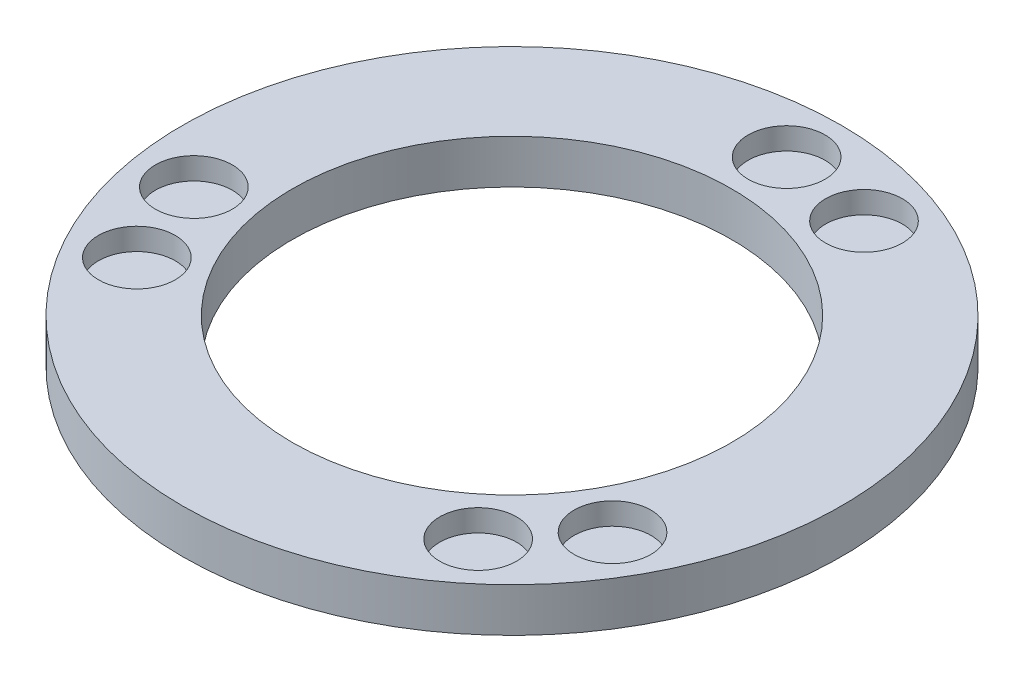
ISO-10303-21;
HEADER;
FILE_DESCRIPTION(('STEP AP214'),'2;1');
FILE_NAME('part.step','',(''),(''),'','','');
FILE_SCHEMA(('AUTOMOTIVE_DESIGN { 1 0 10303 214 1 1 1 1 }'));
ENDSEC;
DATA;
#1=APPLICATION_CONTEXT('core data for automotive mechanical design processes');
#2=APPLICATION_PROTOCOL_DEFINITION('international standard','automotive_design',2000,#1);
#3=PRODUCT_CONTEXT('',#1,'mechanical');
#4=PRODUCT('Part','Part','',(#3));
#5=PRODUCT_RELATED_PRODUCT_CATEGORY('part','',(#4));
#6=PRODUCT_DEFINITION_FORMATION('','',#4);
#7=PRODUCT_DEFINITION_CONTEXT('part definition',#1,'design');
#8=PRODUCT_DEFINITION('design','',#6,#7);
#9=PRODUCT_DEFINITION_SHAPE('','',#8);
#10=(LENGTH_UNIT() NAMED_UNIT(*) SI_UNIT(.MILLI.,.METRE.));
#11=(NAMED_UNIT(*) PLANE_ANGLE_UNIT() SI_UNIT($,.RADIAN.));
#12=(NAMED_UNIT(*) SI_UNIT($,.STERADIAN.) SOLID_ANGLE_UNIT());
#13=UNCERTAINTY_MEASURE_WITH_UNIT(LENGTH_MEASURE(1.E-05),#10,'distance_accuracy_value','');
#14=(GEOMETRIC_REPRESENTATION_CONTEXT(3) GLOBAL_UNCERTAINTY_ASSIGNED_CONTEXT((#13)) GLOBAL_UNIT_ASSIGNED_CONTEXT((#10,
#11,#12)) REPRESENTATION_CONTEXT('',''));
#15=CARTESIAN_POINT('',(0.,0.,0.));
#16=DIRECTION('',(0.,0.,1.));
#17=DIRECTION('',(1.,0.,0.));
#18=AXIS2_PLACEMENT_3D('',#15,#16,#17);
#19=CARTESIAN_POINT('',(0.,-20.,0.));
#20=DIRECTION('',(0.,1.,0.));
#21=DIRECTION('',(0.,0.,1.));
#22=AXIS2_PLACEMENT_3D('',#19,#20,#21);
#23=CYLINDRICAL_SURFACE('',#22,150.);
#24=CARTESIAN_POINT('',(0.,-20.,0.));
#25=DIRECTION('',(0.,1.,0.));
#26=DIRECTION('',(0.,0.,1.));
#27=AXIS2_PLACEMENT_3D('',#24,#25,#26);
#28=CIRCLE('',#27,150.);
#29=CARTESIAN_POINT('',(0.,-20.,150.));
#30=VERTEX_POINT('',#29);
#31=EDGE_CURVE('E10',#30,#30,#28,.T.);
#32=ORIENTED_EDGE('',*,*,#31,.T.);
#33=EDGE_LOOP('',(#32));
#34=FACE_BOUND('',#33,.T.);
#35=CARTESIAN_POINT('',(0.,0.,0.));
#36=DIRECTION('',(0.,1.,0.));
#37=DIRECTION('',(0.,0.,1.));
#38=AXIS2_PLACEMENT_3D('',#35,#36,#37);
#39=CIRCLE('',#38,150.);
#40=CARTESIAN_POINT('',(0.,0.,150.));
#41=VERTEX_POINT('',#40);
#42=EDGE_CURVE('E44',#41,#41,#39,.T.);
#43=ORIENTED_EDGE('',*,*,#42,.F.);
#44=EDGE_LOOP('',(#43));
#45=FACE_BOUND('',#44,.T.);
#46=ADVANCED_FACE('F41',(#34,#45),#23,.T.);
#47=CARTESIAN_POINT('',(0.,-20.,0.));
#48=DIRECTION('',(0.,1.,0.));
#49=DIRECTION('',(0.,0.,1.));
#50=AXIS2_PLACEMENT_3D('',#47,#48,#49);
#51=PLANE('',#50);
#52=CARTESIAN_POINT('',(0.,-20.,0.));
#53=DIRECTION('',(0.,1.,0.));
#54=DIRECTION('',(0.,0.,1.));
#55=AXIS2_PLACEMENT_3D('',#52,#53,#54);
#56=CIRCLE('',#55,100.);
#57=CARTESIAN_POINT('',(0.,-20.,100.));
#58=VERTEX_POINT('',#57);
#59=EDGE_CURVE('E56',#58,#58,#56,.T.);
#60=ORIENTED_EDGE('',*,*,#59,.T.);
#61=EDGE_LOOP('',(#60));
#62=FACE_BOUND('',#61,.T.);
#63=ORIENTED_EDGE('',*,*,#31,.F.);
#64=EDGE_LOOP('',(#63));
#65=FACE_BOUND('',#64,.T.);
#66=ADVANCED_FACE('F122',(#62,#65),#51,.F.);
#67=CARTESIAN_POINT('',(0.,0.,0.));
#68=DIRECTION('',(0.,1.,0.));
#69=DIRECTION('',(0.,0.,1.));
#70=AXIS2_PLACEMENT_3D('',#67,#68,#69);
#71=PLANE('',#70);
#72=CARTESIAN_POINT('',(-123.100969126524,0.,21.7060222083681));
#73=DIRECTION('',(0.,1.,0.));
#74=DIRECTION('',(0.,0.,1.));
#75=AXIS2_PLACEMENT_3D('',#72,#73,#74);
#76=CIRCLE('',#75,17.5000000000038);
#77=CARTESIAN_POINT('',(-123.100969126524,0.,39.2060222083719));
#78=VERTEX_POINT('',#77);
#79=EDGE_CURVE('E100',#78,#78,#76,.T.);
#80=ORIENTED_EDGE('',*,*,#79,.F.);
#81=EDGE_LOOP('',(#80));
#82=FACE_BOUND('',#81,.T.);
#83=CARTESIAN_POINT('',(-108.253175473053,0.,62.5000000000019));
#84=DIRECTION('',(0.,1.,0.));
#85=DIRECTION('',(0.,0.,1.));
#86=AXIS2_PLACEMENT_3D('',#83,#84,#85);
#87=CIRCLE('',#86,17.500000000004);
#88=CARTESIAN_POINT('',(-108.253175473053,0.,80.0000000000059));
#89=VERTEX_POINT('',#88);
#90=EDGE_CURVE('E93',#89,#89,#87,.T.);
#91=ORIENTED_EDGE('',*,*,#90,.F.);
#92=EDGE_LOOP('',(#91));
#93=FACE_BOUND('',#92,.T.);
#94=CARTESIAN_POINT('',(80.3484512108201,0.,95.7555553898714));
#95=DIRECTION('',(0.,1.,0.));
#96=DIRECTION('',(0.,0.,1.));
#97=AXIS2_PLACEMENT_3D('',#94,#95,#96);
#98=CIRCLE('',#97,17.5000000000021);
#99=CARTESIAN_POINT('',(80.3484512108201,0.,113.255555389873));
#100=VERTEX_POINT('',#99);
#101=EDGE_CURVE('E87',#100,#100,#98,.T.);
#102=ORIENTED_EDGE('',*,*,#101,.F.);
#103=EDGE_LOOP('',(#102));
#104=FACE_BOUND('',#103,.T.);
#105=CARTESIAN_POINT('',(108.253175473058,0.,62.499999999999));
#106=DIRECTION('',(0.,1.,0.));
#107=DIRECTION('',(0.,0.,1.));
#108=AXIS2_PLACEMENT_3D('',#105,#106,#107);
#109=CIRCLE('',#108,17.5000000000022);
#110=CARTESIAN_POINT('',(108.253175473058,0.,80.0000000000012));
#111=VERTEX_POINT('',#110);
#112=EDGE_CURVE('E79',#111,#111,#109,.T.);
#113=ORIENTED_EDGE('',*,*,#112,.F.);
#114=EDGE_LOOP('',(#113));
#115=FACE_BOUND('',#114,.T.);
#116=CARTESIAN_POINT('',(42.7525179157087,0.,-117.461577598239));
#117=DIRECTION('',(0.,1.,0.));
#118=DIRECTION('',(0.,0.,1.));
#119=AXIS2_PLACEMENT_3D('',#116,#117,#118);
#120=CIRCLE('',#119,17.5);
#121=CARTESIAN_POINT('',(42.7525179157087,0.,-99.9615775982385));
#122=VERTEX_POINT('',#121);
#123=EDGE_CURVE('E72',#122,#122,#120,.T.);
#124=ORIENTED_EDGE('',*,*,#123,.F.);
#125=EDGE_LOOP('',(#124));
#126=FACE_BOUND('',#125,.T.);
#127=CARTESIAN_POINT('',(0.,0.,-125.));
#128=DIRECTION('',(0.,1.,0.));
#129=DIRECTION('',(0.,0.,1.));
#130=AXIS2_PLACEMENT_3D('',#127,#128,#129);
#131=CIRCLE('',#130,17.5);
#132=CARTESIAN_POINT('',(0.,0.,-107.5));
#133=VERTEX_POINT('',#132);
#134=EDGE_CURVE('E65',#133,#133,#131,.T.);
#135=ORIENTED_EDGE('',*,*,#134,.F.);
#136=EDGE_LOOP('',(#135));
#137=FACE_BOUND('',#136,.T.);
#138=CARTESIAN_POINT('',(0.,0.,0.));
#139=DIRECTION('',(0.,1.,0.));
#140=DIRECTION('',(0.,0.,1.));
#141=AXIS2_PLACEMENT_3D('',#138,#139,#140);
#142=CIRCLE('',#141,100.);
#143=CARTESIAN_POINT('',(0.,0.,100.));
#144=VERTEX_POINT('',#143);
#145=EDGE_CURVE('E58',#144,#144,#142,.T.);
#146=ORIENTED_EDGE('',*,*,#145,.F.);
#147=EDGE_LOOP('',(#146));
#148=FACE_BOUND('',#147,.T.);
#149=ORIENTED_EDGE('',*,*,#42,.T.);
#150=EDGE_LOOP('',(#149));
#151=FACE_BOUND('',#150,.T.);
#152=ADVANCED_FACE('F118',(#82,#93,#104,#115,#126,#137,#148,#151),#71,.T.);
#153=CARTESIAN_POINT('',(0.,-20.,0.));
#154=DIRECTION('',(0.,1.,0.));
#155=DIRECTION('',(0.,0.,1.));
#156=AXIS2_PLACEMENT_3D('',#153,#154,#155);
#157=CYLINDRICAL_SURFACE('',#156,100.);
#158=ORIENTED_EDGE('',*,*,#59,.F.);
#159=EDGE_LOOP('',(#158));
#160=FACE_BOUND('',#159,.T.);
#161=ORIENTED_EDGE('',*,*,#145,.T.);
#162=EDGE_LOOP('',(#161));
#163=FACE_BOUND('',#162,.T.);
#164=ADVANCED_FACE('F121',(#160,#163),#157,.F.);
#165=CARTESIAN_POINT('',(0.,-10.,-125.));
#166=DIRECTION('',(0.,1.,0.));
#167=DIRECTION('',(0.,0.,1.));
#168=AXIS2_PLACEMENT_3D('',#165,#166,#167);
#169=CYLINDRICAL_SURFACE('',#168,17.5);
#170=CARTESIAN_POINT('',(0.,-10.,-125.));
#171=DIRECTION('',(0.,1.,0.));
#172=DIRECTION('',(0.,0.,1.));
#173=AXIS2_PLACEMENT_3D('',#170,#171,#172);
#174=CIRCLE('',#173,17.5);
#175=CARTESIAN_POINT('',(0.,-10.,-107.5));
#176=VERTEX_POINT('',#175);
#177=EDGE_CURVE('E61',#176,#176,#174,.T.);
#178=ORIENTED_EDGE('',*,*,#177,.F.);
#179=EDGE_LOOP('',(#178));
#180=FACE_BOUND('',#179,.T.);
#181=ORIENTED_EDGE('',*,*,#134,.T.);
#182=EDGE_LOOP('',(#181));
#183=FACE_BOUND('',#182,.T.);
#184=ADVANCED_FACE('F148',(#180,#183),#169,.F.);
#185=CARTESIAN_POINT('',(0.,-10.,-125.));
#186=DIRECTION('',(0.,1.,0.));
#187=DIRECTION('',(0.,0.,1.));
#188=AXIS2_PLACEMENT_3D('',#185,#186,#187);
#189=PLANE('',#188);
#190=ORIENTED_EDGE('',*,*,#177,.T.);
#191=EDGE_LOOP('',(#190));
#192=FACE_BOUND('',#191,.T.);
#193=ADVANCED_FACE('F152',(#192),#189,.T.);
#194=CARTESIAN_POINT('',(42.7525179157087,-10.,-117.461577598239));
#195=DIRECTION('',(0.,1.,0.));
#196=DIRECTION('',(0.,0.,1.));
#197=AXIS2_PLACEMENT_3D('',#194,#195,#196);
#198=CYLINDRICAL_SURFACE('',#197,17.5);
#199=CARTESIAN_POINT('',(42.7525179157087,-10.,-117.461577598239));
#200=DIRECTION('',(0.,1.,0.));
#201=DIRECTION('',(0.,0.,1.));
#202=AXIS2_PLACEMENT_3D('',#199,#200,#201);
#203=CIRCLE('',#202,17.5);
#204=CARTESIAN_POINT('',(42.7525179157087,-10.,-99.9615775982385));
#205=VERTEX_POINT('',#204);
#206=EDGE_CURVE('E68',#205,#205,#203,.T.);
#207=ORIENTED_EDGE('',*,*,#206,.F.);
#208=EDGE_LOOP('',(#207));
#209=FACE_BOUND('',#208,.T.);
#210=ORIENTED_EDGE('',*,*,#123,.T.);
#211=EDGE_LOOP('',(#210));
#212=FACE_BOUND('',#211,.T.);
#213=ADVANCED_FACE('F156',(#209,#212),#198,.F.);
#214=CARTESIAN_POINT('',(42.7525179157087,-10.,-117.461577598239));
#215=DIRECTION('',(0.,1.,0.));
#216=DIRECTION('',(0.,0.,1.));
#217=AXIS2_PLACEMENT_3D('',#214,#215,#216);
#218=PLANE('',#217);
#219=ORIENTED_EDGE('',*,*,#206,.T.);
#220=EDGE_LOOP('',(#219));
#221=FACE_BOUND('',#220,.T.);
#222=ADVANCED_FACE('F160',(#221),#218,.T.);
#223=CARTESIAN_POINT('',(108.253175473058,-10.,62.499999999999));
#224=DIRECTION('',(0.,1.,0.));
#225=DIRECTION('',(0.,0.,1.));
#226=AXIS2_PLACEMENT_3D('',#223,#224,#225);
#227=CYLINDRICAL_SURFACE('',#226,17.5000000000022);
#228=CARTESIAN_POINT('',(108.253175473058,-10.,62.499999999999));
#229=DIRECTION('',(0.,1.,0.));
#230=DIRECTION('',(0.,0.,1.));
#231=AXIS2_PLACEMENT_3D('',#228,#229,#230);
#232=CIRCLE('',#231,17.5000000000022);
#233=CARTESIAN_POINT('',(108.253175473058,-10.,80.0000000000012));
#234=VERTEX_POINT('',#233);
#235=EDGE_CURVE('E75',#234,#234,#232,.T.);
#236=ORIENTED_EDGE('',*,*,#235,.F.);
#237=EDGE_LOOP('',(#236));
#238=FACE_BOUND('',#237,.T.);
#239=ORIENTED_EDGE('',*,*,#112,.T.);
#240=EDGE_LOOP('',(#239));
#241=FACE_BOUND('',#240,.T.);
#242=ADVANCED_FACE('F164',(#238,#241),#227,.F.);
#243=CARTESIAN_POINT('',(108.253175473058,-10.,62.499999999999));
#244=DIRECTION('',(0.,1.,0.));
#245=DIRECTION('',(0.,0.,1.));
#246=AXIS2_PLACEMENT_3D('',#243,#244,#245);
#247=PLANE('',#246);
#248=ORIENTED_EDGE('',*,*,#235,.T.);
#249=EDGE_LOOP('',(#248));
#250=FACE_BOUND('',#249,.T.);
#251=ADVANCED_FACE('F168',(#250),#247,.T.);
#252=CARTESIAN_POINT('',(80.3484512108201,-10.,95.7555553898714));
#253=DIRECTION('',(0.,1.,0.));
#254=DIRECTION('',(0.,0.,1.));
#255=AXIS2_PLACEMENT_3D('',#252,#253,#254);
#256=CYLINDRICAL_SURFACE('',#255,17.5000000000021);
#257=CARTESIAN_POINT('',(80.3484512108201,-10.,95.7555553898714));
#258=DIRECTION('',(0.,1.,0.));
#259=DIRECTION('',(0.,0.,1.));
#260=AXIS2_PLACEMENT_3D('',#257,#258,#259);
#261=CIRCLE('',#260,17.5000000000021);
#262=CARTESIAN_POINT('',(80.3484512108201,-10.,113.255555389873));
#263=VERTEX_POINT('',#262);
#264=EDGE_CURVE('E83',#263,#263,#261,.T.);
#265=ORIENTED_EDGE('',*,*,#264,.F.);
#266=EDGE_LOOP('',(#265));
#267=FACE_BOUND('',#266,.T.);
#268=ORIENTED_EDGE('',*,*,#101,.T.);
#269=EDGE_LOOP('',(#268));
#270=FACE_BOUND('',#269,.T.);
#271=ADVANCED_FACE('F172',(#267,#270),#256,.F.);
#272=CARTESIAN_POINT('',(80.3484512108201,-10.,95.7555553898714));
#273=DIRECTION('',(0.,1.,0.));
#274=DIRECTION('',(0.,0.,1.));
#275=AXIS2_PLACEMENT_3D('',#272,#273,#274);
#276=PLANE('',#275);
#277=ORIENTED_EDGE('',*,*,#264,.T.);
#278=EDGE_LOOP('',(#277));
#279=FACE_BOUND('',#278,.T.);
#280=ADVANCED_FACE('F176',(#279),#276,.T.);
#281=CARTESIAN_POINT('',(-108.253175473053,-10.,62.5000000000019));
#282=DIRECTION('',(0.,1.,0.));
#283=DIRECTION('',(0.,0.,1.));
#284=AXIS2_PLACEMENT_3D('',#281,#282,#283);
#285=CYLINDRICAL_SURFACE('',#284,17.500000000004);
#286=CARTESIAN_POINT('',(-108.253175473053,-10.,62.5000000000019));
#287=DIRECTION('',(0.,1.,0.));
#288=DIRECTION('',(0.,0.,1.));
#289=AXIS2_PLACEMENT_3D('',#286,#287,#288);
#290=CIRCLE('',#289,17.500000000004);
#291=CARTESIAN_POINT('',(-108.253175473053,-10.,80.0000000000059));
#292=VERTEX_POINT('',#291);
#293=EDGE_CURVE('E90',#292,#292,#290,.T.);
#294=ORIENTED_EDGE('',*,*,#293,.F.);
#295=EDGE_LOOP('',(#294));
#296=FACE_BOUND('',#295,.T.);
#297=ORIENTED_EDGE('',*,*,#90,.T.);
#298=EDGE_LOOP('',(#297));
#299=FACE_BOUND('',#298,.T.);
#300=ADVANCED_FACE('F180',(#296,#299),#285,.F.);
#301=CARTESIAN_POINT('',(-108.253175473053,-10.,62.5000000000019));
#302=DIRECTION('',(0.,1.,0.));
#303=DIRECTION('',(0.,0.,1.));
#304=AXIS2_PLACEMENT_3D('',#301,#302,#303);
#305=PLANE('',#304);
#306=ORIENTED_EDGE('',*,*,#293,.T.);
#307=EDGE_LOOP('',(#306));
#308=FACE_BOUND('',#307,.T.);
#309=ADVANCED_FACE('F114',(#308),#305,.T.);
#310=CARTESIAN_POINT('',(-123.100969126524,-10.,21.7060222083681));
#311=DIRECTION('',(0.,1.,0.));
#312=DIRECTION('',(0.,0.,1.));
#313=AXIS2_PLACEMENT_3D('',#310,#311,#312);
#314=CYLINDRICAL_SURFACE('',#313,17.5000000000038);
#315=CARTESIAN_POINT('',(-123.100969126524,-10.,21.7060222083681));
#316=DIRECTION('',(0.,1.,0.));
#317=DIRECTION('',(0.,0.,1.));
#318=AXIS2_PLACEMENT_3D('',#315,#316,#317);
#319=CIRCLE('',#318,17.5000000000038);
#320=CARTESIAN_POINT('',(-123.100969126524,-10.,39.2060222083719));
#321=VERTEX_POINT('',#320);
#322=EDGE_CURVE('E96',#321,#321,#319,.T.);
#323=ORIENTED_EDGE('',*,*,#322,.F.);
#324=EDGE_LOOP('',(#323));
#325=FACE_BOUND('',#324,.T.);
#326=ORIENTED_EDGE('',*,*,#79,.T.);
#327=EDGE_LOOP('',(#326));
#328=FACE_BOUND('',#327,.T.);
#329=ADVANCED_FACE('F111',(#325,#328),#314,.F.);
#330=CARTESIAN_POINT('',(-123.100969126524,-10.,21.7060222083681));
#331=DIRECTION('',(0.,1.,0.));
#332=DIRECTION('',(0.,0.,1.));
#333=AXIS2_PLACEMENT_3D('',#330,#331,#332);
#334=PLANE('',#333);
#335=ORIENTED_EDGE('',*,*,#322,.T.);
#336=EDGE_LOOP('',(#335));
#337=FACE_BOUND('',#336,.T.);
#338=ADVANCED_FACE('F109',(#337),#334,.T.);
#339=CLOSED_SHELL('',(#46,#66,#152,#164,#184,#193,#213,#222,#242,#251,#271,#280,#300,#309,#329,#338));
#340=MANIFOLD_SOLID_BREP('B2',#339);
#341=ADVANCED_BREP_SHAPE_REPRESENTATION('',(#18,#340),#14);
#342=SHAPE_DEFINITION_REPRESENTATION(#9,#341);
ENDSEC;
END-ISO-10303-21;
